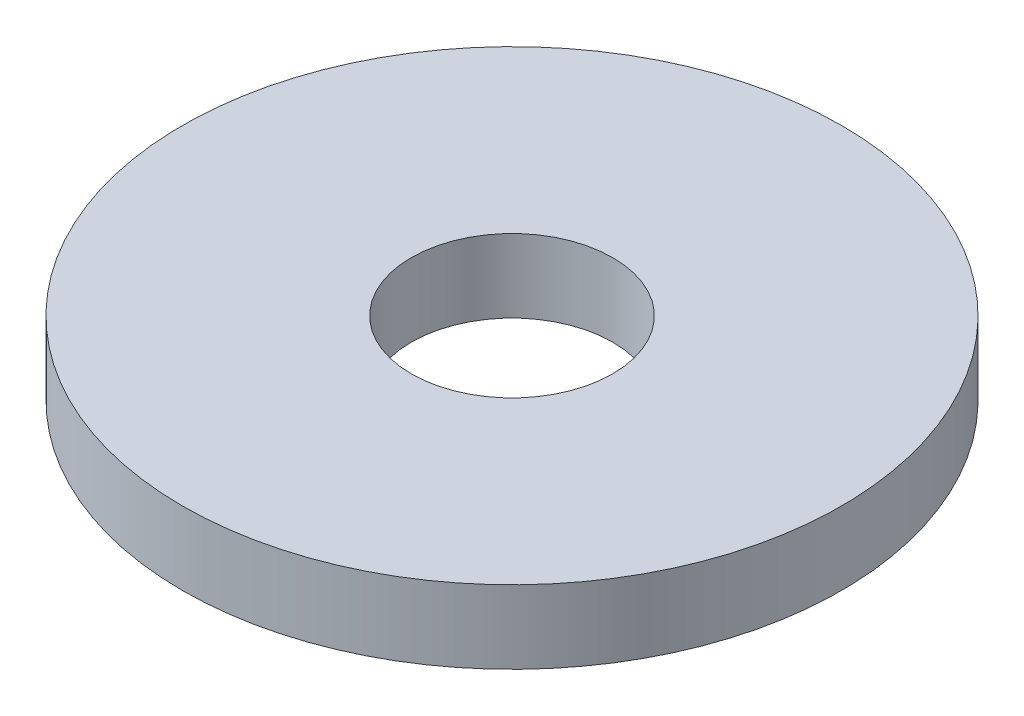
ISO-10303-21;
HEADER;
FILE_DESCRIPTION(('STEP AP214'),'2;1');
FILE_NAME('part.step','',(''),(''),'','','');
FILE_SCHEMA(('AUTOMOTIVE_DESIGN { 1 0 10303 214 1 1 1 1 }'));
ENDSEC;
DATA;
#1=APPLICATION_CONTEXT('core data for automotive mechanical design processes');
#2=APPLICATION_PROTOCOL_DEFINITION('international standard','automotive_design',2000,#1);
#3=PRODUCT_CONTEXT('',#1,'mechanical');
#4=PRODUCT('Part','Part','',(#3));
#5=PRODUCT_RELATED_PRODUCT_CATEGORY('part','',(#4));
#6=PRODUCT_DEFINITION_FORMATION('','',#4);
#7=PRODUCT_DEFINITION_CONTEXT('part definition',#1,'design');
#8=PRODUCT_DEFINITION('design','',#6,#7);
#9=PRODUCT_DEFINITION_SHAPE('','',#8);
#10=(LENGTH_UNIT() NAMED_UNIT(*) SI_UNIT(.MILLI.,.METRE.));
#11=(NAMED_UNIT(*) PLANE_ANGLE_UNIT() SI_UNIT($,.RADIAN.));
#12=(NAMED_UNIT(*) SI_UNIT($,.STERADIAN.) SOLID_ANGLE_UNIT());
#13=UNCERTAINTY_MEASURE_WITH_UNIT(LENGTH_MEASURE(1.E-05),#10,'distance_accuracy_value','');
#14=(GEOMETRIC_REPRESENTATION_CONTEXT(3) GLOBAL_UNCERTAINTY_ASSIGNED_CONTEXT((#13)) GLOBAL_UNIT_ASSIGNED_CONTEXT((#10,
#11,#12)) REPRESENTATION_CONTEXT('',''));
#15=CARTESIAN_POINT('',(0.,0.,0.));
#16=DIRECTION('',(0.,0.,1.));
#17=DIRECTION('',(1.,0.,0.));
#18=AXIS2_PLACEMENT_3D('',#15,#16,#17);
#19=CARTESIAN_POINT('',(0.,-2.,0.));
#20=DIRECTION('',(0.,1.,0.));
#21=DIRECTION('',(0.,0.,1.));
#22=AXIS2_PLACEMENT_3D('',#19,#20,#21);
#23=CYLINDRICAL_SURFACE('',#22,9.);
#24=CARTESIAN_POINT('',(0.,-2.,0.));
#25=DIRECTION('',(0.,1.,0.));
#26=DIRECTION('',(0.,0.,1.));
#27=AXIS2_PLACEMENT_3D('',#24,#25,#26);
#28=CIRCLE('',#27,9.);
#29=CARTESIAN_POINT('',(0.,-2.,9.));
#30=VERTEX_POINT('',#29);
#31=EDGE_CURVE('E10',#30,#30,#28,.T.);
#32=ORIENTED_EDGE('',*,*,#31,.T.);
#33=EDGE_LOOP('',(#32));
#34=FACE_BOUND('',#33,.T.);
#35=CARTESIAN_POINT('',(0.,0.,0.));
#36=DIRECTION('',(0.,1.,0.));
#37=DIRECTION('',(0.,0.,1.));
#38=AXIS2_PLACEMENT_3D('',#35,#36,#37);
#39=CIRCLE('',#38,9.);
#40=CARTESIAN_POINT('',(0.,0.,9.));
#41=VERTEX_POINT('',#40);
#42=EDGE_CURVE('E34',#41,#41,#39,.T.);
#43=ORIENTED_EDGE('',*,*,#42,.F.);
#44=EDGE_LOOP('',(#43));
#45=FACE_BOUND('',#44,.T.);
#46=ADVANCED_FACE('F31',(#34,#45),#23,.T.);
#47=CARTESIAN_POINT('',(0.,-2.,0.));
#48=DIRECTION('',(0.,1.,0.));
#49=DIRECTION('',(0.,0.,1.));
#50=AXIS2_PLACEMENT_3D('',#47,#48,#49);
#51=PLANE('',#50);
#52=CARTESIAN_POINT('',(0.,-2.,0.));
#53=DIRECTION('',(0.,1.,0.));
#54=DIRECTION('',(0.,0.,1.));
#55=AXIS2_PLACEMENT_3D('',#52,#53,#54);
#56=CIRCLE('',#55,2.75);
#57=CARTESIAN_POINT('',(0.,-2.,2.75));
#58=VERTEX_POINT('',#57);
#59=EDGE_CURVE('E41',#58,#58,#56,.T.);
#60=ORIENTED_EDGE('',*,*,#59,.T.);
#61=EDGE_LOOP('',(#60));
#62=FACE_BOUND('',#61,.T.);
#63=ORIENTED_EDGE('',*,*,#31,.F.);
#64=EDGE_LOOP('',(#63));
#65=FACE_BOUND('',#64,.T.);
#66=ADVANCED_FACE('F49',(#62,#65),#51,.F.);
#67=CARTESIAN_POINT('',(0.,0.,0.));
#68=DIRECTION('',(0.,1.,0.));
#69=DIRECTION('',(0.,0.,1.));
#70=AXIS2_PLACEMENT_3D('',#67,#68,#69);
#71=PLANE('',#70);
#72=CARTESIAN_POINT('',(0.,0.,0.));
#73=DIRECTION('',(0.,1.,0.));
#74=DIRECTION('',(0.,0.,1.));
#75=AXIS2_PLACEMENT_3D('',#72,#73,#74);
#76=CIRCLE('',#75,2.75);
#77=CARTESIAN_POINT('',(0.,0.,2.75));
#78=VERTEX_POINT('',#77);
#79=EDGE_CURVE('E43',#78,#78,#76,.T.);
#80=ORIENTED_EDGE('',*,*,#79,.F.);
#81=EDGE_LOOP('',(#80));
#82=FACE_BOUND('',#81,.T.);
#83=ORIENTED_EDGE('',*,*,#42,.T.);
#84=EDGE_LOOP('',(#83));
#85=FACE_BOUND('',#84,.T.);
#86=ADVANCED_FACE('F55',(#82,#85),#71,.T.);
#87=CARTESIAN_POINT('',(0.,-2.,0.));
#88=DIRECTION('',(0.,1.,0.));
#89=DIRECTION('',(0.,0.,1.));
#90=AXIS2_PLACEMENT_3D('',#87,#88,#89);
#91=CYLINDRICAL_SURFACE('',#90,2.75);
#92=ORIENTED_EDGE('',*,*,#59,.F.);
#93=EDGE_LOOP('',(#92));
#94=FACE_BOUND('',#93,.T.);
#95=ORIENTED_EDGE('',*,*,#79,.T.);
#96=EDGE_LOOP('',(#95));
#97=FACE_BOUND('',#96,.T.);
#98=ADVANCED_FACE('F52',(#94,#97),#91,.F.);
#99=CLOSED_SHELL('',(#46,#66,#86,#98));
#100=MANIFOLD_SOLID_BREP('B2',#99);
#101=ADVANCED_BREP_SHAPE_REPRESENTATION('',(#18,#100),#14);
#102=SHAPE_DEFINITION_REPRESENTATION(#9,#101);
ENDSEC;
END-ISO-10303-21;
